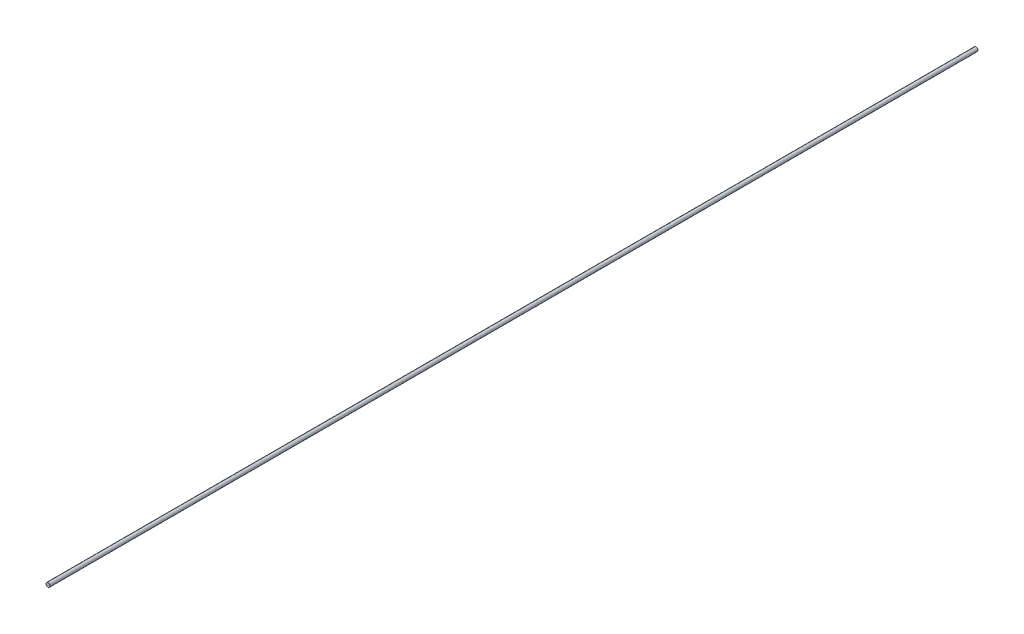
ISO-10303-21;
HEADER;
FILE_DESCRIPTION(('STEP AP214'),'2;1');
FILE_NAME('part.step','',(''),(''),'','','');
FILE_SCHEMA(('AUTOMOTIVE_DESIGN { 1 0 10303 214 1 1 1 1 }'));
ENDSEC;
DATA;
#1=APPLICATION_CONTEXT('core data for automotive mechanical design processes');
#2=APPLICATION_PROTOCOL_DEFINITION('international standard','automotive_design',2000,#1);
#3=PRODUCT_CONTEXT('',#1,'mechanical');
#4=PRODUCT('Part','Part','',(#3));
#5=PRODUCT_RELATED_PRODUCT_CATEGORY('part','',(#4));
#6=PRODUCT_DEFINITION_FORMATION('','',#4);
#7=PRODUCT_DEFINITION_CONTEXT('part definition',#1,'design');
#8=PRODUCT_DEFINITION('design','',#6,#7);
#9=PRODUCT_DEFINITION_SHAPE('','',#8);
#10=(LENGTH_UNIT() NAMED_UNIT(*) SI_UNIT(.MILLI.,.METRE.));
#11=(NAMED_UNIT(*) PLANE_ANGLE_UNIT() SI_UNIT($,.RADIAN.));
#12=(NAMED_UNIT(*) SI_UNIT($,.STERADIAN.) SOLID_ANGLE_UNIT());
#13=UNCERTAINTY_MEASURE_WITH_UNIT(LENGTH_MEASURE(1.E-05),#10,'distance_accuracy_value','');
#14=(GEOMETRIC_REPRESENTATION_CONTEXT(3) GLOBAL_UNCERTAINTY_ASSIGNED_CONTEXT((#13)) GLOBAL_UNIT_ASSIGNED_CONTEXT((#10,
#11,#12)) REPRESENTATION_CONTEXT('',''));
#15=CARTESIAN_POINT('',(0.,0.,0.));
#16=DIRECTION('',(0.,0.,1.));
#17=DIRECTION('',(1.,0.,0.));
#18=AXIS2_PLACEMENT_3D('',#15,#16,#17);
#19=CARTESIAN_POINT('',(0.,0.,465.));
#20=DIRECTION('',(0.,0.,-1.));
#21=DIRECTION('',(-1.,0.,0.));
#22=AXIS2_PLACEMENT_3D('',#19,#20,#21);
#23=CYLINDRICAL_SURFACE('',#22,1.);
#24=CARTESIAN_POINT('',(0.,0.,465.));
#25=DIRECTION('',(0.,0.,1.));
#26=DIRECTION('',(1.,0.,0.));
#27=AXIS2_PLACEMENT_3D('',#24,#25,#26);
#28=CIRCLE('',#27,1.);
#29=CARTESIAN_POINT('',(1.,0.,465.));
#30=VERTEX_POINT('',#29);
#31=EDGE_CURVE('E10',#30,#30,#28,.T.);
#32=ORIENTED_EDGE('',*,*,#31,.F.);
#33=EDGE_LOOP('',(#32));
#34=FACE_BOUND('',#33,.T.);
#35=CARTESIAN_POINT('',(0.,0.,0.));
#36=DIRECTION('',(0.,0.,1.));
#37=DIRECTION('',(1.,0.,0.));
#38=AXIS2_PLACEMENT_3D('',#35,#36,#37);
#39=CIRCLE('',#38,1.);
#40=CARTESIAN_POINT('',(1.,0.,0.));
#41=VERTEX_POINT('',#40);
#42=EDGE_CURVE('E34',#41,#41,#39,.T.);
#43=ORIENTED_EDGE('',*,*,#42,.T.);
#44=EDGE_LOOP('',(#43));
#45=FACE_BOUND('',#44,.T.);
#46=ADVANCED_FACE('F31',(#34,#45),#23,.T.);
#47=CARTESIAN_POINT('',(0.,0.,465.));
#48=DIRECTION('',(0.,0.,1.));
#49=DIRECTION('',(1.,0.,0.));
#50=AXIS2_PLACEMENT_3D('',#47,#48,#49);
#51=PLANE('',#50);
#52=ORIENTED_EDGE('',*,*,#31,.T.);
#53=EDGE_LOOP('',(#52));
#54=FACE_BOUND('',#53,.T.);
#55=ADVANCED_FACE('F46',(#54),#51,.T.);
#56=CARTESIAN_POINT('',(0.,0.,0.));
#57=DIRECTION('',(0.,0.,1.));
#58=DIRECTION('',(1.,0.,0.));
#59=AXIS2_PLACEMENT_3D('',#56,#57,#58);
#60=PLANE('',#59);
#61=ORIENTED_EDGE('',*,*,#42,.F.);
#62=EDGE_LOOP('',(#61));
#63=FACE_BOUND('',#62,.T.);
#64=ADVANCED_FACE('F44',(#63),#60,.F.);
#65=CLOSED_SHELL('',(#46,#55,#64));
#66=MANIFOLD_SOLID_BREP('B2',#65);
#67=ADVANCED_BREP_SHAPE_REPRESENTATION('',(#18,#66),#14);
#68=SHAPE_DEFINITION_REPRESENTATION(#9,#67);
ENDSEC;
END-ISO-10303-21;
